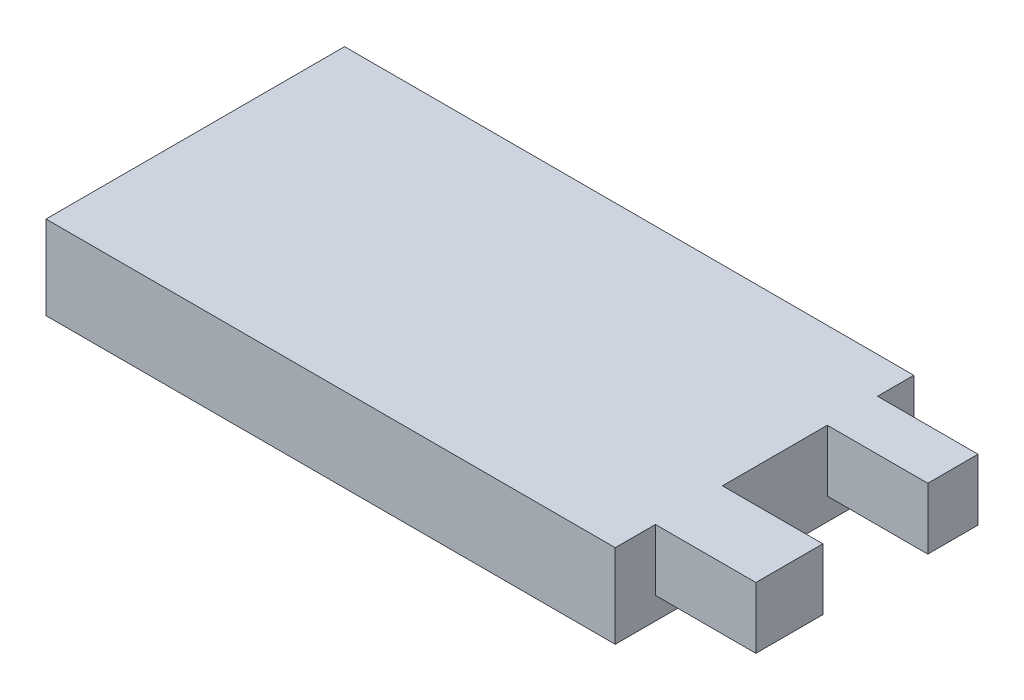
ISO-10303-21;
HEADER;
FILE_DESCRIPTION(('STEP AP214'),'2;1');
FILE_NAME('part.step','',(''),(''),'','','');
FILE_SCHEMA(('AUTOMOTIVE_DESIGN { 1 0 10303 214 1 1 1 1 }'));
ENDSEC;
DATA;
#1=APPLICATION_CONTEXT('core data for automotive mechanical design processes');
#2=APPLICATION_PROTOCOL_DEFINITION('international standard','automotive_design',2000,#1);
#3=PRODUCT_CONTEXT('',#1,'mechanical');
#4=PRODUCT('Part','Part','',(#3));
#5=PRODUCT_RELATED_PRODUCT_CATEGORY('part','',(#4));
#6=PRODUCT_DEFINITION_FORMATION('','',#4);
#7=PRODUCT_DEFINITION_CONTEXT('part definition',#1,'design');
#8=PRODUCT_DEFINITION('design','',#6,#7);
#9=PRODUCT_DEFINITION_SHAPE('','',#8);
#10=(LENGTH_UNIT() NAMED_UNIT(*) SI_UNIT(.MILLI.,.METRE.));
#11=(NAMED_UNIT(*) PLANE_ANGLE_UNIT() SI_UNIT($,.RADIAN.));
#12=(NAMED_UNIT(*) SI_UNIT($,.STERADIAN.) SOLID_ANGLE_UNIT());
#13=UNCERTAINTY_MEASURE_WITH_UNIT(LENGTH_MEASURE(1.E-05),#10,'distance_accuracy_value','');
#14=(GEOMETRIC_REPRESENTATION_CONTEXT(3) GLOBAL_UNCERTAINTY_ASSIGNED_CONTEXT((#13)) GLOBAL_UNIT_ASSIGNED_CONTEXT((#10,
#11,#12)) REPRESENTATION_CONTEXT('',''));
#15=CARTESIAN_POINT('',(0.,0.,0.));
#16=DIRECTION('',(0.,0.,1.));
#17=DIRECTION('',(1.,0.,0.));
#18=AXIS2_PLACEMENT_3D('',#15,#16,#17);
#19=CARTESIAN_POINT('',(51.,15.,26.75));
#20=DIRECTION('',(-1.,0.,0.));
#21=DIRECTION('',(0.,0.,1.));
#22=AXIS2_PLACEMENT_3D('',#19,#20,#21);
#23=PLANE('',#22);
#24=DIRECTION('',(0.,-1.,0.));
#25=VECTOR('',#24,1.);
#26=CARTESIAN_POINT('',(51.,15.,-11.25));
#27=LINE('',#26,#25);
#28=CARTESIAN_POINT('',(51.,15.,-11.25));
#29=VERTEX_POINT('',#28);
#30=CARTESIAN_POINT('',(51.,4.,-11.25));
#31=VERTEX_POINT('',#30);
#32=EDGE_CURVE('E147',#29,#31,#27,.T.);
#33=ORIENTED_EDGE('',*,*,#32,.F.);
#34=DIRECTION('',(0.,0.,-1.));
#35=VECTOR('',#34,1.);
#36=CARTESIAN_POINT('',(51.,15.,26.75));
#37=LINE('',#36,#35);
#38=CARTESIAN_POINT('',(51.,15.,7.54999999999999));
#39=VERTEX_POINT('',#38);
#40=EDGE_CURVE('E193',#39,#29,#37,.T.);
#41=ORIENTED_EDGE('',*,*,#40,.F.);
#42=DIRECTION('',(0.,1.,0.));
#43=VECTOR('',#42,1.);
#44=CARTESIAN_POINT('',(51.,15.,7.54999999999999));
#45=LINE('',#44,#43);
#46=CARTESIAN_POINT('',(51.,4.,7.54999999999999));
#47=VERTEX_POINT('',#46);
#48=EDGE_CURVE('E160',#47,#39,#45,.T.);
#49=ORIENTED_EDGE('',*,*,#48,.F.);
#50=DIRECTION('',(0.,0.,-1.));
#51=VECTOR('',#50,1.);
#52=CARTESIAN_POINT('',(51.,4.,19.55));
#53=LINE('',#52,#51);
#54=CARTESIAN_POINT('',(51.,4.,19.55));
#55=VERTEX_POINT('',#54);
#56=EDGE_CURVE('E59',#55,#47,#53,.T.);
#57=ORIENTED_EDGE('',*,*,#56,.F.);
#58=DIRECTION('',(0.,-1.,0.));
#59=VECTOR('',#58,1.);
#60=CARTESIAN_POINT('',(51.,15.,19.55));
#61=LINE('',#60,#59);
#62=CARTESIAN_POINT('',(51.,15.,19.55));
#63=VERTEX_POINT('',#62);
#64=EDGE_CURVE('E149',#63,#55,#61,.T.);
#65=ORIENTED_EDGE('',*,*,#64,.F.);
#66=CARTESIAN_POINT('',(51.,15.,26.75));
#67=VERTEX_POINT('',#66);
#68=EDGE_CURVE('E195',#67,#63,#37,.T.);
#69=ORIENTED_EDGE('',*,*,#68,.F.);
#70=DIRECTION('',(0.,-1.,0.));
#71=VECTOR('',#70,1.);
#72=CARTESIAN_POINT('',(51.,15.,26.75));
#73=LINE('',#72,#71);
#74=CARTESIAN_POINT('',(51.,0.,26.75));
#75=VERTEX_POINT('',#74);
#76=EDGE_CURVE('E43',#67,#75,#73,.T.);
#77=ORIENTED_EDGE('',*,*,#76,.T.);
#78=DIRECTION('',(0.,0.,-1.));
#79=VECTOR('',#78,1.);
#80=CARTESIAN_POINT('',(51.,0.,26.75));
#81=LINE('',#80,#79);
#82=CARTESIAN_POINT('',(51.,0.,-26.75));
#83=VERTEX_POINT('',#82);
#84=EDGE_CURVE('E211',#75,#83,#81,.T.);
#85=ORIENTED_EDGE('',*,*,#84,.T.);
#86=DIRECTION('',(0.,-1.,0.));
#87=VECTOR('',#86,1.);
#88=CARTESIAN_POINT('',(51.,15.,-26.75));
#89=LINE('',#88,#87);
#90=CARTESIAN_POINT('',(51.,15.,-26.75));
#91=VERTEX_POINT('',#90);
#92=EDGE_CURVE('E218',#91,#83,#89,.T.);
#93=ORIENTED_EDGE('',*,*,#92,.F.);
#94=CARTESIAN_POINT('',(51.,15.,-20.25));
#95=VERTEX_POINT('',#94);
#96=EDGE_CURVE('E37',#95,#91,#37,.T.);
#97=ORIENTED_EDGE('',*,*,#96,.F.);
#98=DIRECTION('',(0.,1.,0.));
#99=VECTOR('',#98,1.);
#100=CARTESIAN_POINT('',(51.,15.,-20.25));
#101=LINE('',#100,#99);
#102=CARTESIAN_POINT('',(51.,4.,-20.25));
#103=VERTEX_POINT('',#102);
#104=EDGE_CURVE('E143',#103,#95,#101,.T.);
#105=ORIENTED_EDGE('',*,*,#104,.F.);
#106=DIRECTION('',(0.,0.,-1.));
#107=VECTOR('',#106,1.);
#108=CARTESIAN_POINT('',(51.,4.,-11.25));
#109=LINE('',#108,#107);
#110=EDGE_CURVE('E371',#31,#103,#109,.T.);
#111=ORIENTED_EDGE('',*,*,#110,.F.);
#112=EDGE_LOOP('',(#33,#41,#49,#57,#65,#69,#77,#85,#93,#97,#105,#111));
#113=FACE_BOUND('',#112,.T.);
#114=ADVANCED_FACE('F33',(#113),#23,.F.);
#115=CARTESIAN_POINT('',(-51.,15.,26.75));
#116=DIRECTION('',(1.,0.,0.));
#117=DIRECTION('',(0.,0.,-1.));
#118=AXIS2_PLACEMENT_3D('',#115,#116,#117);
#119=PLANE('',#118);
#120=DIRECTION('',(0.,0.,1.));
#121=VECTOR('',#120,1.);
#122=CARTESIAN_POINT('',(-51.,0.,26.75));
#123=LINE('',#122,#121);
#124=CARTESIAN_POINT('',(-51.,0.,-26.75));
#125=VERTEX_POINT('',#124);
#126=CARTESIAN_POINT('',(-51.,0.,26.75));
#127=VERTEX_POINT('',#126);
#128=EDGE_CURVE('E206',#125,#127,#123,.T.);
#129=ORIENTED_EDGE('',*,*,#128,.T.);
#130=DIRECTION('',(0.,-1.,0.));
#131=VECTOR('',#130,1.);
#132=CARTESIAN_POINT('',(-51.,15.,26.75));
#133=LINE('',#132,#131);
#134=CARTESIAN_POINT('',(-51.,15.,26.75));
#135=VERTEX_POINT('',#134);
#136=EDGE_CURVE('E11',#135,#127,#133,.T.);
#137=ORIENTED_EDGE('',*,*,#136,.F.);
#138=DIRECTION('',(0.,0.,1.));
#139=VECTOR('',#138,1.);
#140=CARTESIAN_POINT('',(-51.,15.,26.75));
#141=LINE('',#140,#139);
#142=CARTESIAN_POINT('',(-51.,15.,-26.75));
#143=VERTEX_POINT('',#142);
#144=EDGE_CURVE('E215',#143,#135,#141,.T.);
#145=ORIENTED_EDGE('',*,*,#144,.F.);
#146=DIRECTION('',(0.,-1.,0.));
#147=VECTOR('',#146,1.);
#148=CARTESIAN_POINT('',(-51.,15.,-26.75));
#149=LINE('',#148,#147);
#150=EDGE_CURVE('E205',#143,#125,#149,.T.);
#151=ORIENTED_EDGE('',*,*,#150,.T.);
#152=EDGE_LOOP('',(#129,#137,#145,#151));
#153=FACE_BOUND('',#152,.T.);
#154=ADVANCED_FACE('F35',(#153),#119,.F.);
#155=CARTESIAN_POINT('',(51.,15.,26.75));
#156=DIRECTION('',(0.,0.,-1.));
#157=DIRECTION('',(-1.,0.,0.));
#158=AXIS2_PLACEMENT_3D('',#155,#156,#157);
#159=PLANE('',#158);
#160=DIRECTION('',(1.,0.,0.));
#161=VECTOR('',#160,1.);
#162=CARTESIAN_POINT('',(51.,0.,26.75));
#163=LINE('',#162,#161);
#164=EDGE_CURVE('E209',#127,#75,#163,.T.);
#165=ORIENTED_EDGE('',*,*,#164,.T.);
#166=ORIENTED_EDGE('',*,*,#76,.F.);
#167=DIRECTION('',(1.,0.,0.));
#168=VECTOR('',#167,1.);
#169=CARTESIAN_POINT('',(51.,15.,26.75));
#170=LINE('',#169,#168);
#171=EDGE_CURVE('E199',#135,#67,#170,.T.);
#172=ORIENTED_EDGE('',*,*,#171,.F.);
#173=ORIENTED_EDGE('',*,*,#136,.T.);
#174=EDGE_LOOP('',(#165,#166,#172,#173));
#175=FACE_BOUND('',#174,.T.);
#176=ADVANCED_FACE('F246',(#175),#159,.F.);
#177=CARTESIAN_POINT('',(51.,15.,-26.75));
#178=DIRECTION('',(0.,0.,1.));
#179=DIRECTION('',(1.,0.,0.));
#180=AXIS2_PLACEMENT_3D('',#177,#178,#179);
#181=PLANE('',#180);
#182=DIRECTION('',(-1.,0.,0.));
#183=VECTOR('',#182,1.);
#184=CARTESIAN_POINT('',(51.,0.,-26.75));
#185=LINE('',#184,#183);
#186=EDGE_CURVE('E213',#83,#125,#185,.T.);
#187=ORIENTED_EDGE('',*,*,#186,.T.);
#188=ORIENTED_EDGE('',*,*,#150,.F.);
#189=DIRECTION('',(-1.,0.,0.));
#190=VECTOR('',#189,1.);
#191=CARTESIAN_POINT('',(51.,15.,-26.75));
#192=LINE('',#191,#190);
#193=EDGE_CURVE('E201',#91,#143,#192,.T.);
#194=ORIENTED_EDGE('',*,*,#193,.F.);
#195=ORIENTED_EDGE('',*,*,#92,.T.);
#196=EDGE_LOOP('',(#187,#188,#194,#195));
#197=FACE_BOUND('',#196,.T.);
#198=ADVANCED_FACE('F234',(#197),#181,.F.);
#199=CARTESIAN_POINT('',(0.,15.,0.));
#200=DIRECTION('',(0.,1.,0.));
#201=DIRECTION('',(0.,0.,1.));
#202=AXIS2_PLACEMENT_3D('',#199,#200,#201);
#203=PLANE('',#202);
#204=ORIENTED_EDGE('',*,*,#144,.T.);
#205=ORIENTED_EDGE('',*,*,#171,.T.);
#206=ORIENTED_EDGE('',*,*,#68,.T.);
#207=DIRECTION('',(-1.,0.,0.));
#208=VECTOR('',#207,1.);
#209=CARTESIAN_POINT('',(69.,15.,19.55));
#210=LINE('',#209,#208);
#211=CARTESIAN_POINT('',(69.,15.,19.55));
#212=VERTEX_POINT('',#211);
#213=EDGE_CURVE('E166',#212,#63,#210,.T.);
#214=ORIENTED_EDGE('',*,*,#213,.F.);
#215=DIRECTION('',(0.,0.,1.));
#216=VECTOR('',#215,1.);
#217=CARTESIAN_POINT('',(69.,15.,19.55));
#218=LINE('',#217,#216);
#219=CARTESIAN_POINT('',(69.,15.,7.54999999999999));
#220=VERTEX_POINT('',#219);
#221=EDGE_CURVE('E164',#220,#212,#218,.T.);
#222=ORIENTED_EDGE('',*,*,#221,.F.);
#223=DIRECTION('',(-1.,0.,0.));
#224=VECTOR('',#223,1.);
#225=CARTESIAN_POINT('',(69.,15.,7.54999999999999));
#226=LINE('',#225,#224);
#227=EDGE_CURVE('E178',#220,#39,#226,.T.);
#228=ORIENTED_EDGE('',*,*,#227,.T.);
#229=ORIENTED_EDGE('',*,*,#40,.T.);
#230=DIRECTION('',(-1.,0.,0.));
#231=VECTOR('',#230,1.);
#232=CARTESIAN_POINT('',(69.,15.,-11.25));
#233=LINE('',#232,#231);
#234=CARTESIAN_POINT('',(69.,15.,-11.25));
#235=VERTEX_POINT('',#234);
#236=EDGE_CURVE('E376',#235,#29,#233,.T.);
#237=ORIENTED_EDGE('',*,*,#236,.F.);
#238=DIRECTION('',(0.,0.,1.));
#239=VECTOR('',#238,1.);
#240=CARTESIAN_POINT('',(69.,15.,-11.25));
#241=LINE('',#240,#239);
#242=CARTESIAN_POINT('',(69.,15.,-20.25));
#243=VERTEX_POINT('',#242);
#244=EDGE_CURVE('E140',#243,#235,#241,.T.);
#245=ORIENTED_EDGE('',*,*,#244,.F.);
#246=DIRECTION('',(-1.,0.,0.));
#247=VECTOR('',#246,1.);
#248=CARTESIAN_POINT('',(69.,15.,-20.25));
#249=LINE('',#248,#247);
#250=EDGE_CURVE('E51',#243,#95,#249,.T.);
#251=ORIENTED_EDGE('',*,*,#250,.T.);
#252=ORIENTED_EDGE('',*,*,#96,.T.);
#253=ORIENTED_EDGE('',*,*,#193,.T.);
#254=EDGE_LOOP('',(#204,#205,#206,#214,#222,#228,#229,#237,#245,#251,#252,#253));
#255=FACE_BOUND('',#254,.T.);
#256=ADVANCED_FACE('F245',(#255),#203,.T.);
#257=CARTESIAN_POINT('',(0.,0.,0.));
#258=DIRECTION('',(0.,1.,0.));
#259=DIRECTION('',(0.,0.,1.));
#260=AXIS2_PLACEMENT_3D('',#257,#258,#259);
#261=PLANE('',#260);
#262=ORIENTED_EDGE('',*,*,#128,.F.);
#263=ORIENTED_EDGE('',*,*,#186,.F.);
#264=ORIENTED_EDGE('',*,*,#84,.F.);
#265=ORIENTED_EDGE('',*,*,#164,.F.);
#266=EDGE_LOOP('',(#262,#263,#264,#265));
#267=FACE_BOUND('',#266,.T.);
#268=ADVANCED_FACE('F231',(#267),#261,.F.);
#269=CARTESIAN_POINT('',(69.,15.,19.55));
#270=DIRECTION('',(0.,0.,-1.));
#271=DIRECTION('',(-1.,0.,0.));
#272=AXIS2_PLACEMENT_3D('',#269,#270,#271);
#273=PLANE('',#272);
#274=ORIENTED_EDGE('',*,*,#64,.T.);
#275=DIRECTION('',(-1.,0.,0.));
#276=VECTOR('',#275,1.);
#277=CARTESIAN_POINT('',(69.,4.,19.55));
#278=LINE('',#277,#276);
#279=CARTESIAN_POINT('',(69.,4.,19.55));
#280=VERTEX_POINT('',#279);
#281=EDGE_CURVE('E185',#280,#55,#278,.T.);
#282=ORIENTED_EDGE('',*,*,#281,.F.);
#283=DIRECTION('',(0.,-1.,0.));
#284=VECTOR('',#283,1.);
#285=CARTESIAN_POINT('',(69.,15.,19.55));
#286=LINE('',#285,#284);
#287=EDGE_CURVE('E156',#212,#280,#286,.T.);
#288=ORIENTED_EDGE('',*,*,#287,.F.);
#289=ORIENTED_EDGE('',*,*,#213,.T.);
#290=EDGE_LOOP('',(#274,#282,#288,#289));
#291=FACE_BOUND('',#290,.T.);
#292=ADVANCED_FACE('F244',(#291),#273,.F.);
#293=CARTESIAN_POINT('',(69.,4.,19.55));
#294=DIRECTION('',(0.,1.,0.));
#295=DIRECTION('',(0.,0.,1.));
#296=AXIS2_PLACEMENT_3D('',#293,#294,#295);
#297=PLANE('',#296);
#298=ORIENTED_EDGE('',*,*,#56,.T.);
#299=DIRECTION('',(-1.,0.,0.));
#300=VECTOR('',#299,1.);
#301=CARTESIAN_POINT('',(69.,4.,7.54999999999999));
#302=LINE('',#301,#300);
#303=CARTESIAN_POINT('',(69.,4.,7.54999999999999));
#304=VERTEX_POINT('',#303);
#305=EDGE_CURVE('E170',#304,#47,#302,.T.);
#306=ORIENTED_EDGE('',*,*,#305,.F.);
#307=DIRECTION('',(0.,0.,-1.));
#308=VECTOR('',#307,1.);
#309=CARTESIAN_POINT('',(69.,4.,19.55));
#310=LINE('',#309,#308);
#311=EDGE_CURVE('E159',#280,#304,#310,.T.);
#312=ORIENTED_EDGE('',*,*,#311,.F.);
#313=ORIENTED_EDGE('',*,*,#281,.T.);
#314=EDGE_LOOP('',(#298,#306,#312,#313));
#315=FACE_BOUND('',#314,.T.);
#316=ADVANCED_FACE('F242',(#315),#297,.F.);
#317=CARTESIAN_POINT('',(69.,15.,7.54999999999999));
#318=DIRECTION('',(0.,0.,1.));
#319=DIRECTION('',(0.,-1.,0.));
#320=AXIS2_PLACEMENT_3D('',#317,#318,#319);
#321=PLANE('',#320);
#322=ORIENTED_EDGE('',*,*,#48,.T.);
#323=ORIENTED_EDGE('',*,*,#227,.F.);
#324=DIRECTION('',(0.,1.,0.));
#325=VECTOR('',#324,1.);
#326=CARTESIAN_POINT('',(69.,15.,7.54999999999999));
#327=LINE('',#326,#325);
#328=EDGE_CURVE('E162',#304,#220,#327,.T.);
#329=ORIENTED_EDGE('',*,*,#328,.F.);
#330=ORIENTED_EDGE('',*,*,#305,.T.);
#331=EDGE_LOOP('',(#322,#323,#329,#330));
#332=FACE_BOUND('',#331,.T.);
#333=ADVANCED_FACE('F266',(#332),#321,.F.);
#334=CARTESIAN_POINT('',(69.,0.,0.));
#335=DIRECTION('',(1.,0.,0.));
#336=DIRECTION('',(0.,0.,-1.));
#337=AXIS2_PLACEMENT_3D('',#334,#335,#336);
#338=PLANE('',#337);
#339=ORIENTED_EDGE('',*,*,#287,.T.);
#340=ORIENTED_EDGE('',*,*,#311,.T.);
#341=ORIENTED_EDGE('',*,*,#328,.T.);
#342=ORIENTED_EDGE('',*,*,#221,.T.);
#343=EDGE_LOOP('',(#339,#340,#341,#342));
#344=FACE_BOUND('',#343,.T.);
#345=ADVANCED_FACE('F269',(#344),#338,.T.);
#346=CARTESIAN_POINT('',(69.,15.,-11.25));
#347=DIRECTION('',(0.,0.,-1.));
#348=DIRECTION('',(0.,1.,0.));
#349=AXIS2_PLACEMENT_3D('',#346,#347,#348);
#350=PLANE('',#349);
#351=ORIENTED_EDGE('',*,*,#32,.T.);
#352=DIRECTION('',(-1.,0.,0.));
#353=VECTOR('',#352,1.);
#354=CARTESIAN_POINT('',(69.,4.,-11.25));
#355=LINE('',#354,#353);
#356=CARTESIAN_POINT('',(69.,4.,-11.25));
#357=VERTEX_POINT('',#356);
#358=EDGE_CURVE('E129',#357,#31,#355,.T.);
#359=ORIENTED_EDGE('',*,*,#358,.F.);
#360=DIRECTION('',(0.,-1.,0.));
#361=VECTOR('',#360,1.);
#362=CARTESIAN_POINT('',(69.,15.,-11.25));
#363=LINE('',#362,#361);
#364=EDGE_CURVE('E136',#235,#357,#363,.T.);
#365=ORIENTED_EDGE('',*,*,#364,.F.);
#366=ORIENTED_EDGE('',*,*,#236,.T.);
#367=EDGE_LOOP('',(#351,#359,#365,#366));
#368=FACE_BOUND('',#367,.T.);
#369=ADVANCED_FACE('F145',(#368),#350,.F.);
#370=CARTESIAN_POINT('',(69.,4.,-11.25));
#371=DIRECTION('',(0.,1.,0.));
#372=DIRECTION('',(0.,0.,1.));
#373=AXIS2_PLACEMENT_3D('',#370,#371,#372);
#374=PLANE('',#373);
#375=ORIENTED_EDGE('',*,*,#110,.T.);
#376=DIRECTION('',(-1.,0.,0.));
#377=VECTOR('',#376,1.);
#378=CARTESIAN_POINT('',(69.,4.,-20.25));
#379=LINE('',#378,#377);
#380=CARTESIAN_POINT('',(69.,4.,-20.25));
#381=VERTEX_POINT('',#380);
#382=EDGE_CURVE('E132',#381,#103,#379,.T.);
#383=ORIENTED_EDGE('',*,*,#382,.F.);
#384=DIRECTION('',(0.,0.,-1.));
#385=VECTOR('',#384,1.);
#386=CARTESIAN_POINT('',(69.,4.,-11.25));
#387=LINE('',#386,#385);
#388=EDGE_CURVE('E125',#357,#381,#387,.T.);
#389=ORIENTED_EDGE('',*,*,#388,.F.);
#390=ORIENTED_EDGE('',*,*,#358,.T.);
#391=EDGE_LOOP('',(#375,#383,#389,#390));
#392=FACE_BOUND('',#391,.T.);
#393=ADVANCED_FACE('F127',(#392),#374,.F.);
#394=CARTESIAN_POINT('',(69.,15.,-20.25));
#395=DIRECTION('',(0.,0.,1.));
#396=DIRECTION('',(0.,-1.,0.));
#397=AXIS2_PLACEMENT_3D('',#394,#395,#396);
#398=PLANE('',#397);
#399=ORIENTED_EDGE('',*,*,#104,.T.);
#400=ORIENTED_EDGE('',*,*,#250,.F.);
#401=DIRECTION('',(0.,1.,0.));
#402=VECTOR('',#401,1.);
#403=CARTESIAN_POINT('',(69.,15.,-20.25));
#404=LINE('',#403,#402);
#405=EDGE_CURVE('E135',#381,#243,#404,.T.);
#406=ORIENTED_EDGE('',*,*,#405,.F.);
#407=ORIENTED_EDGE('',*,*,#382,.T.);
#408=EDGE_LOOP('',(#399,#400,#406,#407));
#409=FACE_BOUND('',#408,.T.);
#410=ADVANCED_FACE('F278',(#409),#398,.F.);
#411=CARTESIAN_POINT('',(69.,0.,0.));
#412=DIRECTION('',(1.,0.,0.));
#413=DIRECTION('',(0.,0.,-1.));
#414=AXIS2_PLACEMENT_3D('',#411,#412,#413);
#415=PLANE('',#414);
#416=ORIENTED_EDGE('',*,*,#364,.T.);
#417=ORIENTED_EDGE('',*,*,#388,.T.);
#418=ORIENTED_EDGE('',*,*,#405,.T.);
#419=ORIENTED_EDGE('',*,*,#244,.T.);
#420=EDGE_LOOP('',(#416,#417,#418,#419));
#421=FACE_BOUND('',#420,.T.);
#422=ADVANCED_FACE('F139',(#421),#415,.T.);
#423=CLOSED_SHELL('',(#114,#154,#176,#198,#256,#268,#292,#316,#333,#345,#369,#393,#410,#422));
#424=MANIFOLD_SOLID_BREP('B2',#423);
#425=ADVANCED_BREP_SHAPE_REPRESENTATION('',(#18,#424),#14);
#426=SHAPE_DEFINITION_REPRESENTATION(#9,#425);
ENDSEC;
END-ISO-10303-21;
